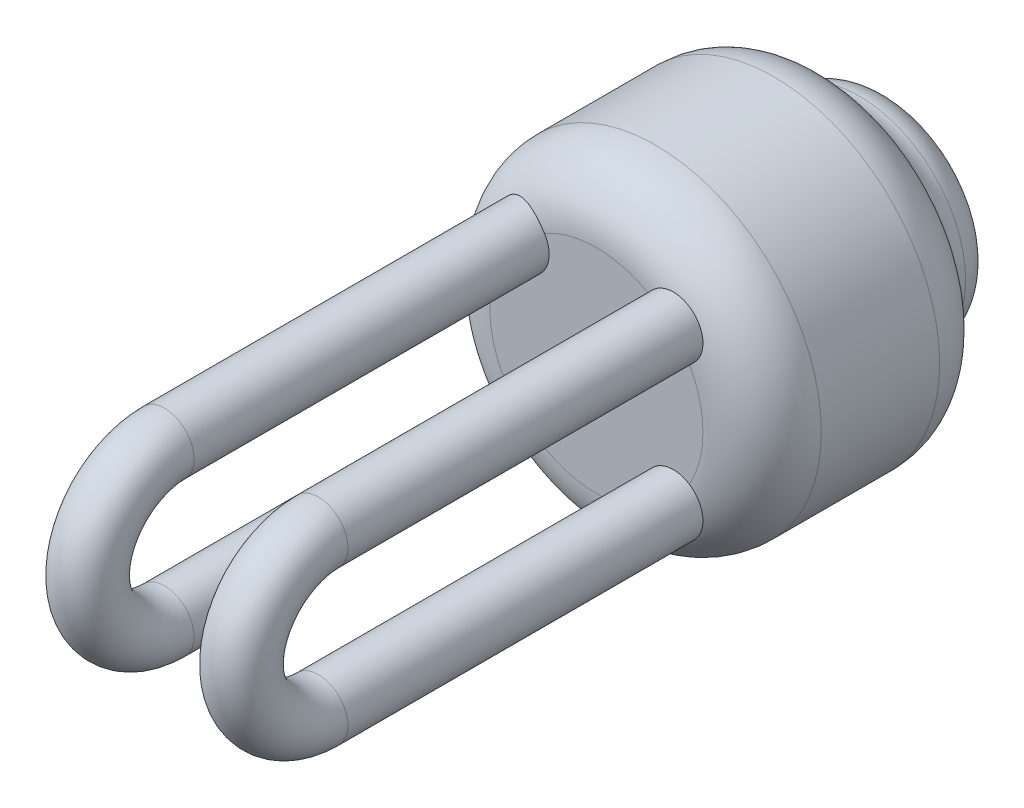
ISO-10303-21;
HEADER;
FILE_DESCRIPTION(('STEP AP214'),'2;1');
FILE_NAME('part.step','',(''),(''),'','','');
FILE_SCHEMA(('AUTOMOTIVE_DESIGN { 1 0 10303 214 1 1 1 1 }'));
ENDSEC;
DATA;
#1=APPLICATION_CONTEXT('core data for automotive mechanical design processes');
#2=APPLICATION_PROTOCOL_DEFINITION('international standard','automotive_design',2000,#1);
#3=PRODUCT_CONTEXT('',#1,'mechanical');
#4=PRODUCT('Part','Part','',(#3));
#5=PRODUCT_RELATED_PRODUCT_CATEGORY('part','',(#4));
#6=PRODUCT_DEFINITION_FORMATION('','',#4);
#7=PRODUCT_DEFINITION_CONTEXT('part definition',#1,'design');
#8=PRODUCT_DEFINITION('design','',#6,#7);
#9=PRODUCT_DEFINITION_SHAPE('','',#8);
#10=(LENGTH_UNIT() NAMED_UNIT(*) SI_UNIT(.MILLI.,.METRE.));
#11=(NAMED_UNIT(*) PLANE_ANGLE_UNIT() SI_UNIT($,.RADIAN.));
#12=(NAMED_UNIT(*) SI_UNIT($,.STERADIAN.) SOLID_ANGLE_UNIT());
#13=UNCERTAINTY_MEASURE_WITH_UNIT(LENGTH_MEASURE(1.E-05),#10,'distance_accuracy_value','');
#14=(GEOMETRIC_REPRESENTATION_CONTEXT(3) GLOBAL_UNCERTAINTY_ASSIGNED_CONTEXT((#13)) GLOBAL_UNIT_ASSIGNED_CONTEXT((#10,
#11,#12)) REPRESENTATION_CONTEXT('',''));
#15=CARTESIAN_POINT('',(0.,0.,0.));
#16=DIRECTION('',(0.,0.,1.));
#17=DIRECTION('',(1.,0.,0.));
#18=AXIS2_PLACEMENT_3D('',#15,#16,#17);
#19=CARTESIAN_POINT('',(0.,0.,40.));
#20=DIRECTION('',(0.,0.,1.));
#21=DIRECTION('',(1.,0.,0.));
#22=AXIS2_PLACEMENT_3D('',#19,#20,#21);
#23=PLANE('',#22);
#24=CARTESIAN_POINT('',(0.,0.,40.));
#25=DIRECTION('',(0.,0.,1.));
#26=DIRECTION('',(1.,0.,0.));
#27=AXIS2_PLACEMENT_3D('',#24,#25,#26);
#28=CIRCLE('',#27,18.);
#29=CARTESIAN_POINT('',(-8.79493125972869,-15.7050687402713,40.));
#30=VERTEX_POINT('',#29);
#31=CARTESIAN_POINT('',(8.79493125972869,-15.7050687402713,40.));
#32=VERTEX_POINT('',#31);
#33=EDGE_CURVE('E97',#30,#32,#28,.T.);
#34=ORIENTED_EDGE('',*,*,#33,.T.);
#35=CARTESIAN_POINT('',(13.,-13.,40.));
#36=DIRECTION('',(0.,0.,1.));
#37=DIRECTION('',(-1.,0.,0.));
#38=AXIS2_PLACEMENT_3D('',#35,#36,#37);
#39=CIRCLE('',#38,5.);
#40=CARTESIAN_POINT('',(15.7050687402713,-8.79493125972868,40.));
#41=VERTEX_POINT('',#40);
#42=EDGE_CURVE('E59',#32,#41,#39,.F.);
#43=ORIENTED_EDGE('',*,*,#42,.T.);
#44=CARTESIAN_POINT('',(15.7050687402713,8.79493125972868,40.));
#45=VERTEX_POINT('',#44);
#46=EDGE_CURVE('E84',#41,#45,#28,.T.);
#47=ORIENTED_EDGE('',*,*,#46,.T.);
#48=CARTESIAN_POINT('',(13.,13.,40.));
#49=DIRECTION('',(0.,0.,-1.));
#50=DIRECTION('',(-1.,0.,0.));
#51=AXIS2_PLACEMENT_3D('',#48,#49,#50);
#52=CIRCLE('',#51,5.);
#53=CARTESIAN_POINT('',(8.79493125972868,15.7050687402713,40.));
#54=VERTEX_POINT('',#53);
#55=EDGE_CURVE('E79',#54,#45,#52,.F.);
#56=ORIENTED_EDGE('',*,*,#55,.F.);
#57=CARTESIAN_POINT('',(-8.79493125972869,15.7050687402713,40.));
#58=VERTEX_POINT('',#57);
#59=EDGE_CURVE('E82',#54,#58,#28,.T.);
#60=ORIENTED_EDGE('',*,*,#59,.T.);
#61=CARTESIAN_POINT('',(-13.,13.,40.));
#62=DIRECTION('',(0.,0.,1.));
#63=DIRECTION('',(1.,0.,0.));
#64=AXIS2_PLACEMENT_3D('',#61,#62,#63);
#65=CIRCLE('',#64,5.);
#66=CARTESIAN_POINT('',(-15.7050687402713,8.79493125972868,40.));
#67=VERTEX_POINT('',#66);
#68=EDGE_CURVE('E116',#67,#58,#65,.T.);
#69=ORIENTED_EDGE('',*,*,#68,.F.);
#70=CARTESIAN_POINT('',(0.,0.,40.));
#71=DIRECTION('',(0.,0.,1.));
#72=DIRECTION('',(1.,0.,0.));
#73=AXIS2_PLACEMENT_3D('',#70,#71,#72);
#74=CIRCLE('',#73,18.);
#75=CARTESIAN_POINT('',(-15.7050687402713,-8.79493125972868,40.));
#76=VERTEX_POINT('',#75);
#77=EDGE_CURVE('E95',#67,#76,#74,.T.);
#78=ORIENTED_EDGE('',*,*,#77,.T.);
#79=CARTESIAN_POINT('',(-13.,-13.,40.));
#80=DIRECTION('',(0.,0.,-1.));
#81=DIRECTION('',(1.,0.,0.));
#82=AXIS2_PLACEMENT_3D('',#79,#80,#81);
#83=CIRCLE('',#82,5.);
#84=EDGE_CURVE('E88',#76,#30,#83,.T.);
#85=ORIENTED_EDGE('',*,*,#84,.T.);
#86=EDGE_LOOP('',(#34,#43,#47,#56,#60,#69,#78,#85));
#87=FACE_BOUND('',#86,.T.);
#88=ADVANCED_FACE('F37',(#87),#23,.T.);
#89=CARTESIAN_POINT('',(0.,0.,40.));
#90=DIRECTION('',(0.,0.,-1.));
#91=DIRECTION('',(-1.,0.,0.));
#92=AXIS2_PLACEMENT_3D('',#89,#90,#91);
#93=CYLINDRICAL_SURFACE('',#92,28.);
#94=CARTESIAN_POINT('',(0.,0.,10.));
#95=DIRECTION('',(0.,0.,1.));
#96=DIRECTION('',(1.,0.,0.));
#97=AXIS2_PLACEMENT_3D('',#94,#95,#96);
#98=CIRCLE('',#97,28.);
#99=CARTESIAN_POINT('',(28.,0.,10.));
#100=VERTEX_POINT('',#99);
#101=EDGE_CURVE('E121',#100,#100,#98,.T.);
#102=ORIENTED_EDGE('',*,*,#101,.T.);
#103=EDGE_LOOP('',(#102));
#104=FACE_BOUND('',#103,.T.);
#105=CARTESIAN_POINT('',(0.,0.,30.));
#106=DIRECTION('',(0.,0.,1.));
#107=DIRECTION('',(1.,0.,0.));
#108=AXIS2_PLACEMENT_3D('',#105,#106,#107);
#109=CIRCLE('',#108,28.);
#110=CARTESIAN_POINT('',(28.,0.,30.));
#111=VERTEX_POINT('',#110);
#112=EDGE_CURVE('E118',#111,#111,#109,.F.);
#113=ORIENTED_EDGE('',*,*,#112,.T.);
#114=EDGE_LOOP('',(#113));
#115=FACE_BOUND('',#114,.T.);
#116=ADVANCED_FACE('F164',(#104,#115),#93,.T.);
#117=CARTESIAN_POINT('',(-13.,-13.,40.));
#118=DIRECTION('',(0.,0.,1.));
#119=DIRECTION('',(0.,-1.,0.));
#120=AXIS2_PLACEMENT_3D('',#117,#118,#119);
#121=CYLINDRICAL_SURFACE('',#120,5.);
#122=CARTESIAN_POINT('',(-13.,-13.,100.));
#123=DIRECTION('',(0.,0.,-1.));
#124=DIRECTION('',(1.,0.,0.));
#125=AXIS2_PLACEMENT_3D('',#122,#123,#124);
#126=CIRCLE('',#125,5.);
#127=CARTESIAN_POINT('',(-13.,-18.,100.));
#128=VERTEX_POINT('',#127);
#129=EDGE_CURVE('E110',#128,#128,#126,.T.);
#130=ORIENTED_EDGE('',*,*,#129,.T.);
#131=EDGE_LOOP('',(#130));
#132=FACE_BOUND('',#131,.T.);
#133=ORIENTED_EDGE('',*,*,#84,.F.);
#134=CARTESIAN_POINT('',(-15.7050687402713,-8.79493125972868,40.));
#135=CARTESIAN_POINT('',(-15.8163835032424,-8.86651247230031,40.0000208783942));
#136=CARTESIAN_POINT('',(-15.9248202378881,-8.94254123750419,39.9973830561889));
#137=CARTESIAN_POINT('',(-16.1351419358603,-9.10278350169539,39.9870240288856));
#138=CARTESIAN_POINT('',(-16.2370295727783,-9.1869936250236,39.9793049128194));
#139=CARTESIAN_POINT('',(-16.4331434423615,-9.36258409800152,39.9590589296195));
#140=CARTESIAN_POINT('',(-16.527399634913,-9.45393333344944,39.9465520902934));
#141=CARTESIAN_POINT('',(-16.7081231184342,-9.64337078118806,39.9170809836427));
#142=CARTESIAN_POINT('',(-16.7945898679819,-9.74145946108427,39.900116406794));
#143=CARTESIAN_POINT('',(-16.9591153992836,-9.94347484827929,39.8621715061709));
#144=CARTESIAN_POINT('',(-17.0371864923369,-10.0473926576582,39.8411971912456));
#145=CARTESIAN_POINT('',(-17.1847017077283,-10.2604588515048,39.7956835865598));
#146=CARTESIAN_POINT('',(-17.2541425828292,-10.3696091835037,39.7711429624154));
#147=CARTESIAN_POINT('',(-17.4490959787924,-10.7039123141988,39.6928853468708));
#148=CARTESIAN_POINT('',(-17.5612544865186,-10.935936043909,39.6345289551391));
#149=CARTESIAN_POINT('',(-17.7534434560097,-11.4258472731319,39.506235820186));
#150=CARTESIAN_POINT('',(-17.8313006381665,-11.6844553978317,39.4358310745163));
#151=CARTESIAN_POINT('',(-17.9444766903144,-12.2097958818742,39.2911505119513));
#152=CARTESIAN_POINT('',(-17.9797789104734,-12.4765313792696,39.2168731917427));
#153=CARTESIAN_POINT('',(-18.0082033925138,-13.0329617484856,39.0641436648311));
#154=CARTESIAN_POINT('',(-17.997961206272,-13.3228773321335,38.9857965004426));
#155=CARTESIAN_POINT('',(-17.9448809945903,-13.7544896356921,38.8746450514191));
#156=CARTESIAN_POINT('',(-17.9208744512575,-13.8979060459582,38.8386354822778));
#157=CARTESIAN_POINT('',(-17.8602721043116,-14.1827602148154,38.7695890600976));
#158=CARTESIAN_POINT('',(-17.8236822536418,-14.3241988761777,38.7365508106857));
#159=CARTESIAN_POINT('',(-17.7385034483728,-14.6023362344675,38.6746881270326));
#160=CARTESIAN_POINT('',(-17.6900702672178,-14.7390720874472,38.6458161646261));
#161=CARTESIAN_POINT('',(-17.5811559972358,-15.0085089408966,38.5926052932143));
#162=CARTESIAN_POINT('',(-17.5206806493876,-15.1412118294257,38.5682642348051));
#163=CARTESIAN_POINT('',(-17.387991082749,-15.4014270485604,38.5248390294575));
#164=CARTESIAN_POINT('',(-17.3157833842674,-15.5289422133286,38.5057519783635));
#165=CARTESIAN_POINT('',(-17.1600656438218,-15.7776558734585,38.4734330346605));
#166=CARTESIAN_POINT('',(-17.0765568887376,-15.8988550858602,38.4602004761169));
#167=CARTESIAN_POINT('',(-16.9073975489538,-16.122496004894,38.4410029312217));
#168=CARTESIAN_POINT('',(-16.8227161020015,-16.2256229620129,38.4344637981646));
#169=CARTESIAN_POINT('',(-16.6452685998903,-16.4248811160828,38.4267268371734));
#170=CARTESIAN_POINT('',(-16.5525030774848,-16.52101277327,38.4255286575331));
#171=CARTESIAN_POINT('',(-16.3596427846795,-16.7054828906483,38.4285085919973));
#172=CARTESIAN_POINT('',(-16.2595495706768,-16.7938229970218,38.4326855675289));
#173=CARTESIAN_POINT('',(-16.0528424801443,-16.9620590673663,38.446291064676));
#174=CARTESIAN_POINT('',(-15.94622868539,-17.0419551372009,38.455719520444));
#175=CARTESIAN_POINT('',(-15.7333905345204,-17.1885964599699,38.4789029957457));
#176=CARTESIAN_POINT('',(-15.627468891229,-17.2558239450373,38.4923907651926));
#177=CARTESIAN_POINT('',(-15.411326150748,-17.381915605259,38.5234832371303));
#178=CARTESIAN_POINT('',(-15.3011036836688,-17.4407770875147,38.5410892604262));
#179=CARTESIAN_POINT('',(-14.9651449273242,-17.6043601101634,38.5994915704161));
#180=CARTESIAN_POINT('',(-14.7339531332807,-17.6961926864649,38.6458908913451));
#181=CARTESIAN_POINT('',(-14.2496543231182,-17.8483499390885,38.752692677286));
#182=CARTESIAN_POINT('',(-13.9960474925408,-17.9065975665013,38.8137389750337));
#183=CARTESIAN_POINT('',(-13.4847016461696,-17.9831639066677,38.94334081524));
#184=CARTESIAN_POINT('',(-13.2269607357698,-18.0014637526607,39.0118998898291));
#185=CARTESIAN_POINT('',(-12.6878255644237,-17.9982037974523,39.1583844054043));
#186=CARTESIAN_POINT('',(-12.4065270568823,-17.9726637524321,39.2365784765177));
#187=CARTESIAN_POINT('',(-11.8511812844164,-17.8743875675768,39.390094914367));
#188=CARTESIAN_POINT('',(-11.5771370292287,-17.8016321482164,39.4654160947029));
#189=CARTESIAN_POINT('',(-11.1728412224893,-17.6564909092711,39.5727321841712));
#190=CARTESIAN_POINT('',(-11.0372127316345,-17.6009824071044,39.6080471590411));
#191=CARTESIAN_POINT('',(-10.7707311507405,-17.4779308281313,39.6755011486155));
#192=CARTESIAN_POINT('',(-10.6398759772816,-17.4103930793474,39.7076415596478));
#193=CARTESIAN_POINT('',(-10.3840704028587,-17.263642335226,39.7679415013076));
#194=CARTESIAN_POINT('',(-10.2591152900394,-17.1844388718796,39.7961042456055));
#195=CARTESIAN_POINT('',(-10.0161386256808,-17.0147856213123,39.847720837167));
#196=CARTESIAN_POINT('',(-9.89811301154855,-16.9243425225426,39.8711774634108));
#197=CARTESIAN_POINT('',(-9.68895495183813,-16.7486561607366,39.9092698861306));
#198=CARTESIAN_POINT('',(-9.59660601956905,-16.66503279541,39.9247231837997));
#199=CARTESIAN_POINT('',(-9.41812656945637,-16.4908067219379,39.951536813504));
#200=CARTESIAN_POINT('',(-9.3319948105495,-16.4002054142246,39.9628979642246));
#201=CARTESIAN_POINT('',(-9.16630796184842,-16.2122478958253,39.98126374374));
#202=CARTESIAN_POINT('',(-9.08677439150612,-16.1148713511022,39.9882545689173));
#203=CARTESIAN_POINT('',(-8.93512819863889,-15.914221596324,39.9976323728936));
#204=CARTESIAN_POINT('',(-8.86301912944122,-15.8109455992467,40.0000171568721));
#205=CARTESIAN_POINT('',(-8.79493125972869,-15.7050687402713,40.));
#206=B_SPLINE_CURVE_WITH_KNOTS('',3,(#134,#135,#136,#137,#138,#139,#140,#141,#142,#143,#144,
#145,#146,#147,#148,#149,#150,#151,#152,#153,#154,#155,#156,#157,#158,#159,#160,#161,#162,#163,
#164,#165,#166,#167,#168,#169,#170,#171,#172,#173,#174,#175,#176,#177,#178,#179,#180,#181,#182,
#183,#184,#185,#186,#187,#188,#189,#190,#191,#192,#193,#194,#195,#196,#197,#198,#199,#200,#201,
#202,#203,#204,#205),.UNSPECIFIED.,.F.,.F.,(4,2,2,2,2,2,2,2,2,2,2,2,2,2,2,2,2,2,2,2,2,2,2,2,2,2,
2,2,2,2,2,2,2,2,2,4),(0.,0.396877604614156,0.793592145916658,1.18866498806757,1.58376526944751,
1.97827804428459,2.37293881339712,3.16218782225863,3.99602952369992,4.83019736390862,
5.72696954288941,6.17592060223317,6.62465956216067,7.06778694024735,7.51070356553895,
7.95337487454115,8.39599581779164,8.79627379878841,9.19652542074987,9.59669227480743,
9.99685411135308,10.3749497641013,10.7531668462275,11.5090083686561,12.307621693403,
13.1066121101687,13.9820304691589,14.8578065141653,15.3095468462452,15.761087587743,
16.2122614038093,16.6631680108155,17.0393910635623,17.4155388063113,17.7928686827394,
18.17037831595),.UNSPECIFIED.);
#207=EDGE_CURVE('E132',#76,#30,#206,.T.);
#208=ORIENTED_EDGE('',*,*,#207,.T.);
#209=EDGE_LOOP('',(#133,#208));
#210=FACE_BOUND('',#209,.T.);
#211=ADVANCED_FACE('F168',(#132,#210),#121,.T.);
#212=CARTESIAN_POINT('',(-13.,0.,100.));
#213=DIRECTION('',(-1.,0.,0.));
#214=DIRECTION('',(0.,0.,1.));
#215=AXIS2_PLACEMENT_3D('',#212,#213,#214);
#216=TOROIDAL_SURFACE('',#215,13.,5.);
#217=CARTESIAN_POINT('',(-13.,13.,100.));
#218=DIRECTION('',(0.,0.,1.));
#219=DIRECTION('',(1.,0.,0.));
#220=AXIS2_PLACEMENT_3D('',#217,#218,#219);
#221=CIRCLE('',#220,5.);
#222=CARTESIAN_POINT('',(-13.,18.,100.));
#223=VERTEX_POINT('',#222);
#224=EDGE_CURVE('E113',#223,#223,#221,.T.);
#225=CARTESIAN_POINT('',(-13.,0.,100.));
#226=DIRECTION('',(-1.,0.,0.));
#227=DIRECTION('',(0.,0.,1.));
#228=AXIS2_PLACEMENT_3D('',#225,#226,#227);
#229=CIRCLE('',#228,18.);
#230=EDGE_CURVE('',#128,#223,#229,.T.);
#231=ORIENTED_EDGE('',*,*,#129,.F.);
#232=ORIENTED_EDGE('',*,*,#224,.T.);
#233=ORIENTED_EDGE('',*,*,#230,.T.);
#234=ORIENTED_EDGE('',*,*,#230,.F.);
#235=EDGE_LOOP('',(#231,#233,#232,#234));
#236=FACE_BOUND('',#235,.T.);
#237=ADVANCED_FACE('F173',(#236),#216,.T.);
#238=CARTESIAN_POINT('',(-13.,13.,100.));
#239=DIRECTION('',(0.,0.,-1.));
#240=DIRECTION('',(0.,1.,0.));
#241=AXIS2_PLACEMENT_3D('',#238,#239,#240);
#242=CYLINDRICAL_SURFACE('',#241,5.);
#243=ORIENTED_EDGE('',*,*,#68,.T.);
#244=CARTESIAN_POINT('',(-8.79493125972869,15.7050687402713,40.));
#245=CARTESIAN_POINT('',(-8.86651247230032,15.8163835032424,40.0000208783942));
#246=CARTESIAN_POINT('',(-8.9425412375042,15.9248202378881,39.9973830561889));
#247=CARTESIAN_POINT('',(-9.1027835016954,16.1351419358603,39.9870240288856));
#248=CARTESIAN_POINT('',(-9.18699362502361,16.2370295727783,39.9793049128194));
#249=CARTESIAN_POINT('',(-9.36258409800153,16.4331434423615,39.9590589296195));
#250=CARTESIAN_POINT('',(-9.45393333344945,16.527399634913,39.9465520902934));
#251=CARTESIAN_POINT('',(-9.64337078118807,16.7081231184342,39.9170809836427));
#252=CARTESIAN_POINT('',(-9.74145946108428,16.7945898679819,39.900116406794));
#253=CARTESIAN_POINT('',(-9.94347484827929,16.9591153992836,39.8621715061709));
#254=CARTESIAN_POINT('',(-10.0473926576582,17.0371864923369,39.8411971912456));
#255=CARTESIAN_POINT('',(-10.2604588515048,17.1847017077283,39.7956835865598));
#256=CARTESIAN_POINT('',(-10.3696091835037,17.2541425828292,39.7711429624154));
#257=CARTESIAN_POINT('',(-10.7039123141988,17.4490959787924,39.6928853468708));
#258=CARTESIAN_POINT('',(-10.935936043909,17.5612544865186,39.6345289551391));
#259=CARTESIAN_POINT('',(-11.4258472731319,17.7534434560097,39.506235820186));
#260=CARTESIAN_POINT('',(-11.6844553978317,17.8313006381665,39.4358310745163));
#261=CARTESIAN_POINT('',(-12.2097958818742,17.9444766903144,39.2911505119513));
#262=CARTESIAN_POINT('',(-12.4765313792696,17.9797789104734,39.2168731917427));
#263=CARTESIAN_POINT('',(-13.0329617484856,18.0082033925138,39.0641436648311));
#264=CARTESIAN_POINT('',(-13.3228773321335,17.997961206272,38.9857965004426));
#265=CARTESIAN_POINT('',(-13.7544896356921,17.9448809945903,38.8746450514191));
#266=CARTESIAN_POINT('',(-13.8979060459582,17.9208744512575,38.8386354822778));
#267=CARTESIAN_POINT('',(-14.1827602148154,17.8602721043116,38.7695890600976));
#268=CARTESIAN_POINT('',(-14.3241988761777,17.8236822536418,38.7365508106857));
#269=CARTESIAN_POINT('',(-14.6023362344676,17.7385034483728,38.6746881270326));
#270=CARTESIAN_POINT('',(-14.7390720874472,17.6900702672178,38.6458161646261));
#271=CARTESIAN_POINT('',(-15.0085089408966,17.5811559972358,38.5926052932143));
#272=CARTESIAN_POINT('',(-15.1412118294257,17.5206806493876,38.5682642348051));
#273=CARTESIAN_POINT('',(-15.4014270485604,17.387991082749,38.5248390294575));
#274=CARTESIAN_POINT('',(-15.5289422133286,17.3157833842674,38.5057519783635));
#275=CARTESIAN_POINT('',(-15.7776558734585,17.1600656438218,38.4734330346605));
#276=CARTESIAN_POINT('',(-15.8988550858602,17.0765568887376,38.4602004761169));
#277=CARTESIAN_POINT('',(-16.122496004894,16.9073975489538,38.4410029312217));
#278=CARTESIAN_POINT('',(-16.225622962013,16.8227161020015,38.4344637981646));
#279=CARTESIAN_POINT('',(-16.4248811160828,16.6452685998903,38.4267268371734));
#280=CARTESIAN_POINT('',(-16.52101277327,16.5525030774848,38.4255286575331));
#281=CARTESIAN_POINT('',(-16.7054828906484,16.3596427846795,38.4285085919973));
#282=CARTESIAN_POINT('',(-16.7938229970218,16.2595495706768,38.4326855675289));
#283=CARTESIAN_POINT('',(-16.9620590673663,16.0528424801443,38.446291064676));
#284=CARTESIAN_POINT('',(-17.0419551372009,15.94622868539,38.455719520444));
#285=CARTESIAN_POINT('',(-17.1885964599699,15.7333905345204,38.4789029957457));
#286=CARTESIAN_POINT('',(-17.2558239450373,15.627468891229,38.4923907651926));
#287=CARTESIAN_POINT('',(-17.381915605259,15.411326150748,38.5234832371303));
#288=CARTESIAN_POINT('',(-17.4407770875147,15.3011036836688,38.5410892604262));
#289=CARTESIAN_POINT('',(-17.6043601101634,14.9651449273242,38.5994915704161));
#290=CARTESIAN_POINT('',(-17.6961926864649,14.7339531332806,38.6458908913451));
#291=CARTESIAN_POINT('',(-17.8483499390885,14.2496543231182,38.752692677286));
#292=CARTESIAN_POINT('',(-17.9065975665013,13.9960474925408,38.8137389750337));
#293=CARTESIAN_POINT('',(-17.9831639066677,13.4847016461696,38.94334081524));
#294=CARTESIAN_POINT('',(-18.0014637526607,13.2269607357697,39.0118998898291));
#295=CARTESIAN_POINT('',(-17.9982037974523,12.6878255644237,39.1583844054043));
#296=CARTESIAN_POINT('',(-17.9726637524321,12.4065270568823,39.2365784765177));
#297=CARTESIAN_POINT('',(-17.8743875675768,11.8511812844164,39.390094914367));
#298=CARTESIAN_POINT('',(-17.8016321482164,11.5771370292287,39.4654160947029));
#299=CARTESIAN_POINT('',(-17.6564909092711,11.1728412224893,39.5727321841712));
#300=CARTESIAN_POINT('',(-17.6009824071044,11.0372127316345,39.6080471590411));
#301=CARTESIAN_POINT('',(-17.4779308281313,10.7707311507405,39.6755011486155));
#302=CARTESIAN_POINT('',(-17.4103930793474,10.6398759772816,39.7076415596478));
#303=CARTESIAN_POINT('',(-17.263642335226,10.3840704028587,39.7679415013076));
#304=CARTESIAN_POINT('',(-17.1844388718796,10.2591152900394,39.7961042456055));
#305=CARTESIAN_POINT('',(-17.0147856213123,10.0161386256808,39.847720837167));
#306=CARTESIAN_POINT('',(-16.9243425225426,9.89811301154855,39.8711774634108));
#307=CARTESIAN_POINT('',(-16.7486561607366,9.68895495183812,39.9092698861306));
#308=CARTESIAN_POINT('',(-16.66503279541,9.59660601956905,39.9247231837997));
#309=CARTESIAN_POINT('',(-16.4908067219379,9.41812656945636,39.951536813504));
#310=CARTESIAN_POINT('',(-16.4002054142246,9.33199481054949,39.9628979642246));
#311=CARTESIAN_POINT('',(-16.2122478958253,9.16630796184842,39.98126374374));
#312=CARTESIAN_POINT('',(-16.1148713511022,9.08677439150611,39.9882545689173));
#313=CARTESIAN_POINT('',(-15.914221596324,8.93512819863889,39.9976323728936));
#314=CARTESIAN_POINT('',(-15.8109455992467,8.86301912944122,40.0000171568721));
#315=CARTESIAN_POINT('',(-15.7050687402713,8.79493125972869,40.));
#316=B_SPLINE_CURVE_WITH_KNOTS('',3,(#244,#245,#246,#247,#248,#249,#250,#251,#252,#253,#254,
#255,#256,#257,#258,#259,#260,#261,#262,#263,#264,#265,#266,#267,#268,#269,#270,#271,#272,#273,
#274,#275,#276,#277,#278,#279,#280,#281,#282,#283,#284,#285,#286,#287,#288,#289,#290,#291,#292,
#293,#294,#295,#296,#297,#298,#299,#300,#301,#302,#303,#304,#305,#306,#307,#308,#309,#310,#311,
#312,#313,#314,#315),.UNSPECIFIED.,.F.,.F.,(4,2,2,2,2,2,2,2,2,2,2,2,2,2,2,2,2,2,2,2,2,2,2,2,2,2,
2,2,2,2,2,2,2,2,2,4),(0.,0.396877604614158,0.793592145916664,1.18866498806757,1.58376526944751,
1.97827804428459,2.37293881339712,3.16218782225863,3.99602952369991,4.83019736390861,
5.72696954288941,6.17592060223317,6.62465956216066,7.06778694024735,7.51070356553895,
7.95337487454115,8.39599581779164,8.79627379878842,9.19652542074987,9.59669227480743,
9.99685411135308,10.3749497641013,10.7531668462275,11.5090083686561,12.307621693403,
13.1066121101687,13.9820304691589,14.8578065141653,15.3095468462452,15.761087587743,
16.2122614038093,16.6631680108155,17.0393910635623,17.4155388063113,17.7928686827394,
18.17037831595),.UNSPECIFIED.);
#317=EDGE_CURVE('E93',#58,#67,#316,.T.);
#318=ORIENTED_EDGE('',*,*,#317,.T.);
#319=EDGE_LOOP('',(#243,#318));
#320=FACE_BOUND('',#319,.T.);
#321=ORIENTED_EDGE('',*,*,#224,.F.);
#322=EDGE_LOOP('',(#321));
#323=FACE_BOUND('',#322,.T.);
#324=ADVANCED_FACE('F138',(#320,#323),#242,.T.);
#325=CARTESIAN_POINT('',(0.,0.,10.));
#326=DIRECTION('',(0.,0.,1.));
#327=DIRECTION('',(1.,0.,0.));
#328=AXIS2_PLACEMENT_3D('',#325,#326,#327);
#329=TOROIDAL_SURFACE('',#328,18.,10.);
#330=CARTESIAN_POINT('',(0.,0.,0.722253208417159));
#331=DIRECTION('',(0.,0.,1.));
#332=DIRECTION('',(1.,0.,0.));
#333=AXIS2_PLACEMENT_3D('',#330,#331,#332);
#334=CIRCLE('',#333,21.7314091803599);
#335=CARTESIAN_POINT('',(21.7314091803599,0.,0.722253208417159));
#336=VERTEX_POINT('',#335);
#337=EDGE_CURVE('E11',#336,#336,#334,.T.);
#338=ORIENTED_EDGE('',*,*,#337,.T.);
#339=EDGE_LOOP('',(#338));
#340=FACE_BOUND('',#339,.T.);
#341=ORIENTED_EDGE('',*,*,#101,.F.);
#342=EDGE_LOOP('',(#341));
#343=FACE_BOUND('',#342,.T.);
#344=ADVANCED_FACE('F146',(#340,#343),#329,.T.);
#345=CARTESIAN_POINT('',(0.,0.,30.));
#346=DIRECTION('',(0.,0.,1.));
#347=DIRECTION('',(1.,0.,0.));
#348=AXIS2_PLACEMENT_3D('',#345,#346,#347);
#349=TOROIDAL_SURFACE('',#348,18.,10.);
#350=ORIENTED_EDGE('',*,*,#112,.F.);
#351=EDGE_LOOP('',(#350));
#352=FACE_BOUND('',#351,.T.);
#353=ORIENTED_EDGE('',*,*,#317,.F.);
#354=ORIENTED_EDGE('',*,*,#59,.F.);
#355=EDGE_CURVE('E52',#45,#54,#28,.T.);
#356=ORIENTED_EDGE('',*,*,#355,.F.);
#357=ORIENTED_EDGE('',*,*,#46,.F.);
#358=EDGE_CURVE('E125',#32,#41,#28,.T.);
#359=ORIENTED_EDGE('',*,*,#358,.F.);
#360=ORIENTED_EDGE('',*,*,#33,.F.);
#361=ORIENTED_EDGE('',*,*,#207,.F.);
#362=ORIENTED_EDGE('',*,*,#77,.F.);
#363=EDGE_LOOP('',(#353,#354,#356,#357,#359,#360,#361,#362));
#364=FACE_BOUND('',#363,.T.);
#365=ADVANCED_FACE('F91',(#352,#364),#349,.T.);
#366=CARTESIAN_POINT('',(13.,-13.,40.));
#367=DIRECTION('',(0.,0.,-1.));
#368=DIRECTION('',(-1.,0.,0.));
#369=AXIS2_PLACEMENT_3D('',#366,#367,#368);
#370=PLANE('',#369);
#371=ORIENTED_EDGE('',*,*,#358,.T.);
#372=EDGE_CURVE('E200',#41,#32,#39,.F.);
#373=ORIENTED_EDGE('',*,*,#372,.T.);
#374=EDGE_LOOP('',(#371,#373));
#375=FACE_BOUND('',#374,.T.);
#376=ADVANCED_FACE('F145',(#375),#370,.T.);
#377=CARTESIAN_POINT('',(13.,13.,40.));
#378=DIRECTION('',(0.,0.,1.));
#379=DIRECTION('',(-1.,0.,0.));
#380=AXIS2_PLACEMENT_3D('',#377,#378,#379);
#381=PLANE('',#380);
#382=ORIENTED_EDGE('',*,*,#355,.T.);
#383=EDGE_CURVE('E89',#45,#54,#52,.F.);
#384=ORIENTED_EDGE('',*,*,#383,.F.);
#385=EDGE_LOOP('',(#382,#384));
#386=FACE_BOUND('',#385,.T.);
#387=ADVANCED_FACE('F99',(#386),#381,.F.);
#388=CARTESIAN_POINT('',(13.,-13.,40.));
#389=DIRECTION('',(0.,0.,1.));
#390=DIRECTION('',(0.,-1.,0.));
#391=AXIS2_PLACEMENT_3D('',#388,#389,#390);
#392=CYLINDRICAL_SURFACE('',#391,5.);
#393=CARTESIAN_POINT('',(13.,-13.,100.));
#394=DIRECTION('',(0.,0.,1.));
#395=DIRECTION('',(-1.,0.,0.));
#396=AXIS2_PLACEMENT_3D('',#393,#394,#395);
#397=CIRCLE('',#396,5.);
#398=CARTESIAN_POINT('',(13.,-18.,100.));
#399=VERTEX_POINT('',#398);
#400=EDGE_CURVE('E104',#399,#399,#397,.F.);
#401=ORIENTED_EDGE('',*,*,#400,.T.);
#402=EDGE_LOOP('',(#401));
#403=FACE_BOUND('',#402,.T.);
#404=ORIENTED_EDGE('',*,*,#42,.F.);
#405=ORIENTED_EDGE('',*,*,#372,.F.);
#406=EDGE_LOOP('',(#404,#405));
#407=FACE_BOUND('',#406,.T.);
#408=ADVANCED_FACE('F205',(#403,#407),#392,.T.);
#409=CARTESIAN_POINT('',(13.,0.,100.));
#410=DIRECTION('',(-1.,0.,0.));
#411=DIRECTION('',(0.,0.,1.));
#412=AXIS2_PLACEMENT_3D('',#409,#410,#411);
#413=TOROIDAL_SURFACE('',#412,13.,5.);
#414=CARTESIAN_POINT('',(13.,13.,100.));
#415=DIRECTION('',(0.,0.,-1.));
#416=DIRECTION('',(-1.,0.,0.));
#417=AXIS2_PLACEMENT_3D('',#414,#415,#416);
#418=CIRCLE('',#417,5.);
#419=CARTESIAN_POINT('',(13.,18.,100.));
#420=VERTEX_POINT('',#419);
#421=EDGE_CURVE('E102',#420,#420,#418,.F.);
#422=CARTESIAN_POINT('',(13.,0.,100.));
#423=DIRECTION('',(-1.,0.,0.));
#424=DIRECTION('',(0.,0.,1.));
#425=AXIS2_PLACEMENT_3D('',#422,#423,#424);
#426=CIRCLE('',#425,18.);
#427=EDGE_CURVE('',#399,#420,#426,.T.);
#428=ORIENTED_EDGE('',*,*,#400,.F.);
#429=ORIENTED_EDGE('',*,*,#421,.T.);
#430=ORIENTED_EDGE('',*,*,#427,.T.);
#431=ORIENTED_EDGE('',*,*,#427,.F.);
#432=EDGE_LOOP('',(#428,#430,#429,#431));
#433=FACE_BOUND('',#432,.T.);
#434=ADVANCED_FACE('F207',(#433),#413,.T.);
#435=CARTESIAN_POINT('',(13.,13.,100.));
#436=DIRECTION('',(0.,0.,-1.));
#437=DIRECTION('',(0.,1.,0.));
#438=AXIS2_PLACEMENT_3D('',#435,#436,#437);
#439=CYLINDRICAL_SURFACE('',#438,5.);
#440=ORIENTED_EDGE('',*,*,#55,.T.);
#441=ORIENTED_EDGE('',*,*,#383,.T.);
#442=EDGE_LOOP('',(#440,#441));
#443=FACE_BOUND('',#442,.T.);
#444=ORIENTED_EDGE('',*,*,#421,.F.);
#445=EDGE_LOOP('',(#444));
#446=FACE_BOUND('',#445,.T.);
#447=ADVANCED_FACE('F100',(#443,#446),#439,.T.);
#448=CARTESIAN_POINT('',(0.,0.,-10.));
#449=DIRECTION('',(0.,0.,-1.));
#450=DIRECTION('',(-1.,0.,0.));
#451=AXIS2_PLACEMENT_3D('',#448,#449,#450);
#452=PLANE('',#451);
#453=CARTESIAN_POINT('',(0.,0.,-10.));
#454=DIRECTION('',(0.,0.,-1.));
#455=DIRECTION('',(-1.,0.,0.));
#456=AXIS2_PLACEMENT_3D('',#453,#454,#455);
#457=CIRCLE('',#456,12.);
#458=CARTESIAN_POINT('',(-12.,0.,-10.));
#459=VERTEX_POINT('',#458);
#460=EDGE_CURVE('E192',#459,#459,#457,.T.);
#461=ORIENTED_EDGE('',*,*,#460,.T.);
#462=EDGE_LOOP('',(#461));
#463=FACE_BOUND('',#462,.T.);
#464=ADVANCED_FACE('F152',(#463),#452,.T.);
#465=CARTESIAN_POINT('',(0.,0.,-4.));
#466=DIRECTION('',(0.,0.,-1.));
#467=DIRECTION('',(-1.,0.,0.));
#468=AXIS2_PLACEMENT_3D('',#465,#466,#467);
#469=TOROIDAL_SURFACE('',#468,12.,6.);
#470=CARTESIAN_POINT('',(0.,0.,-4.42219743326627));
#471=DIRECTION('',(0.,0.,1.));
#472=DIRECTION('',(1.,0.,0.));
#473=AXIS2_PLACEMENT_3D('',#470,#471,#472);
#474=CIRCLE('',#473,17.9851273442879);
#475=CARTESIAN_POINT('',(17.9851273442879,0.,-4.42219743326627));
#476=VERTEX_POINT('',#475);
#477=EDGE_CURVE('E45',#476,#476,#474,.F.);
#478=ORIENTED_EDGE('',*,*,#477,.T.);
#479=EDGE_LOOP('',(#478));
#480=FACE_BOUND('',#479,.T.);
#481=ORIENTED_EDGE('',*,*,#460,.F.);
#482=EDGE_LOOP('',(#481));
#483=FACE_BOUND('',#482,.T.);
#484=ADVANCED_FACE('F149',(#480,#483),#469,.T.);
#485=CARTESIAN_POINT('',(0.,0.,-4.84439486653253));
#486=DIRECTION('',(0.,0.,-1.));
#487=DIRECTION('',(-1.,0.,0.));
#488=AXIS2_PLACEMENT_3D('',#485,#486,#487);
#489=TOROIDAL_SURFACE('',#488,23.9702546885759,6.);
#490=ORIENTED_EDGE('',*,*,#337,.F.);
#491=EDGE_LOOP('',(#490));
#492=FACE_BOUND('',#491,.T.);
#493=ORIENTED_EDGE('',*,*,#477,.F.);
#494=EDGE_LOOP('',(#493));
#495=FACE_BOUND('',#494,.T.);
#496=ADVANCED_FACE('F39',(#492,#495),#489,.F.);
#497=CLOSED_SHELL('',(#88,#116,#211,#237,#324,#344,#365,#376,#387,#408,#434,#447,#464,#484,#496));
#498=MANIFOLD_SOLID_BREP('B2',#497);
#499=ADVANCED_BREP_SHAPE_REPRESENTATION('',(#18,#498),#14);
#500=SHAPE_DEFINITION_REPRESENTATION(#9,#499);
ENDSEC;
END-ISO-10303-21;
